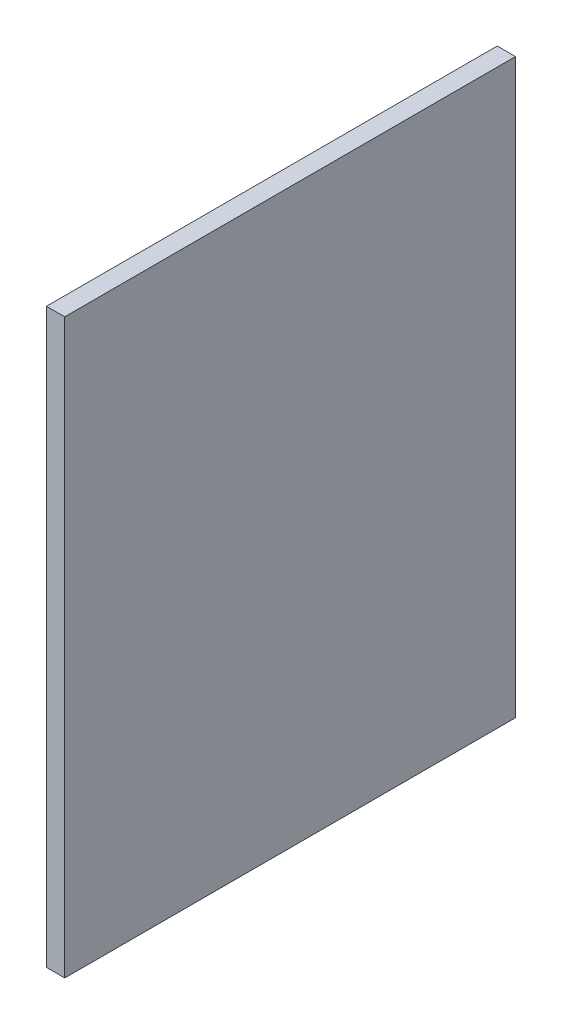
ISO-10303-21;
HEADER;
FILE_DESCRIPTION(('STEP AP214'),'2;1');
FILE_NAME('part.step','',(''),(''),'','','');
FILE_SCHEMA(('AUTOMOTIVE_DESIGN { 1 0 10303 214 1 1 1 1 }'));
ENDSEC;
DATA;
#1=APPLICATION_CONTEXT('core data for automotive mechanical design processes');
#2=APPLICATION_PROTOCOL_DEFINITION('international standard','automotive_design',2000,#1);
#3=PRODUCT_CONTEXT('',#1,'mechanical');
#4=PRODUCT('Part','Part','',(#3));
#5=PRODUCT_RELATED_PRODUCT_CATEGORY('part','',(#4));
#6=PRODUCT_DEFINITION_FORMATION('','',#4);
#7=PRODUCT_DEFINITION_CONTEXT('part definition',#1,'design');
#8=PRODUCT_DEFINITION('design','',#6,#7);
#9=PRODUCT_DEFINITION_SHAPE('','',#8);
#10=(LENGTH_UNIT() NAMED_UNIT(*) SI_UNIT(.MILLI.,.METRE.));
#11=(NAMED_UNIT(*) PLANE_ANGLE_UNIT() SI_UNIT($,.RADIAN.));
#12=(NAMED_UNIT(*) SI_UNIT($,.STERADIAN.) SOLID_ANGLE_UNIT());
#13=UNCERTAINTY_MEASURE_WITH_UNIT(LENGTH_MEASURE(1.E-05),#10,'distance_accuracy_value','');
#14=(GEOMETRIC_REPRESENTATION_CONTEXT(3) GLOBAL_UNCERTAINTY_ASSIGNED_CONTEXT((#13)) GLOBAL_UNIT_ASSIGNED_CONTEXT((#10,
#11,#12)) REPRESENTATION_CONTEXT('',''));
#15=CARTESIAN_POINT('',(0.,0.,0.));
#16=DIRECTION('',(0.,0.,1.));
#17=DIRECTION('',(1.,0.,0.));
#18=AXIS2_PLACEMENT_3D('',#15,#16,#17);
#19=CARTESIAN_POINT('',(1518.99999242226,970.,-460.));
#20=DIRECTION('',(0.,-1.,0.));
#21=DIRECTION('',(0.,0.,-1.));
#22=AXIS2_PLACEMENT_3D('',#19,#20,#21);
#23=PLANE('',#22);
#24=DIRECTION('',(0.,0.,1.));
#25=VECTOR('',#24,1.);
#26=CARTESIAN_POINT('',(1488.99999242226,970.,-460.));
#27=LINE('',#26,#25);
#28=CARTESIAN_POINT('',(1488.99999242226,970.,-460.));
#29=VERTEX_POINT('',#28);
#30=CARTESIAN_POINT('',(1488.99999242226,970.,280.));
#31=VERTEX_POINT('',#30);
#32=EDGE_CURVE('E61',#29,#31,#27,.T.);
#33=ORIENTED_EDGE('',*,*,#32,.T.);
#34=DIRECTION('',(-1.,0.,0.));
#35=VECTOR('',#34,1.);
#36=CARTESIAN_POINT('',(1518.99999242226,970.,280.));
#37=LINE('',#36,#35);
#38=CARTESIAN_POINT('',(1518.99999242226,970.,280.));
#39=VERTEX_POINT('',#38);
#40=EDGE_CURVE('E11',#39,#31,#37,.T.);
#41=ORIENTED_EDGE('',*,*,#40,.F.);
#42=DIRECTION('',(0.,0.,1.));
#43=VECTOR('',#42,1.);
#44=CARTESIAN_POINT('',(1518.99999242226,970.,-460.));
#45=LINE('',#44,#43);
#46=CARTESIAN_POINT('',(1518.99999242226,970.,-460.));
#47=VERTEX_POINT('',#46);
#48=EDGE_CURVE('E80',#47,#39,#45,.T.);
#49=ORIENTED_EDGE('',*,*,#48,.F.);
#50=DIRECTION('',(-1.,0.,0.));
#51=VECTOR('',#50,1.);
#52=CARTESIAN_POINT('',(1518.99999242226,970.,-460.));
#53=LINE('',#52,#51);
#54=EDGE_CURVE('E73',#47,#29,#53,.T.);
#55=ORIENTED_EDGE('',*,*,#54,.T.);
#56=EDGE_LOOP('',(#33,#41,#49,#55));
#57=FACE_BOUND('',#56,.T.);
#58=ADVANCED_FACE('F17',(#57),#23,.F.);
#59=CARTESIAN_POINT('',(1518.99999242226,970.,280.));
#60=DIRECTION('',(0.,0.,-1.));
#61=DIRECTION('',(0.,1.,0.));
#62=AXIS2_PLACEMENT_3D('',#59,#60,#61);
#63=PLANE('',#62);
#64=DIRECTION('',(0.,-1.,0.));
#65=VECTOR('',#64,1.);
#66=CARTESIAN_POINT('',(1488.99999242226,970.,280.));
#67=LINE('',#66,#65);
#68=CARTESIAN_POINT('',(1488.99999242226,30.0000000000009,280.));
#69=VERTEX_POINT('',#68);
#70=EDGE_CURVE('E57',#31,#69,#67,.T.);
#71=ORIENTED_EDGE('',*,*,#70,.T.);
#72=DIRECTION('',(-1.,0.,0.));
#73=VECTOR('',#72,1.);
#74=CARTESIAN_POINT('',(1518.99999242226,30.0000000000009,280.));
#75=LINE('',#74,#73);
#76=CARTESIAN_POINT('',(1518.99999242226,30.0000000000009,280.));
#77=VERTEX_POINT('',#76);
#78=EDGE_CURVE('E24',#77,#69,#75,.T.);
#79=ORIENTED_EDGE('',*,*,#78,.F.);
#80=DIRECTION('',(0.,-1.,0.));
#81=VECTOR('',#80,1.);
#82=CARTESIAN_POINT('',(1518.99999242226,970.,280.));
#83=LINE('',#82,#81);
#84=EDGE_CURVE('E69',#39,#77,#83,.T.);
#85=ORIENTED_EDGE('',*,*,#84,.F.);
#86=ORIENTED_EDGE('',*,*,#40,.T.);
#87=EDGE_LOOP('',(#71,#79,#85,#86));
#88=FACE_BOUND('',#87,.T.);
#89=ADVANCED_FACE('F68',(#88),#63,.F.);
#90=CARTESIAN_POINT('',(1518.99999242226,30.0000000000011,280.));
#91=DIRECTION('',(0.,1.,0.));
#92=DIRECTION('',(0.,0.,1.));
#93=AXIS2_PLACEMENT_3D('',#90,#91,#92);
#94=PLANE('',#93);
#95=DIRECTION('',(0.,0.,-1.));
#96=VECTOR('',#95,1.);
#97=CARTESIAN_POINT('',(1488.99999242226,30.0000000000011,280.));
#98=LINE('',#97,#96);
#99=CARTESIAN_POINT('',(1488.99999242226,30.0000000000011,-460.));
#100=VERTEX_POINT('',#99);
#101=EDGE_CURVE('E62',#69,#100,#98,.T.);
#102=ORIENTED_EDGE('',*,*,#101,.T.);
#103=DIRECTION('',(-1.,0.,0.));
#104=VECTOR('',#103,1.);
#105=CARTESIAN_POINT('',(1518.99999242226,30.0000000000011,-460.));
#106=LINE('',#105,#104);
#107=CARTESIAN_POINT('',(1518.99999242226,30.0000000000011,-460.));
#108=VERTEX_POINT('',#107);
#109=EDGE_CURVE('E85',#108,#100,#106,.T.);
#110=ORIENTED_EDGE('',*,*,#109,.F.);
#111=DIRECTION('',(0.,0.,-1.));
#112=VECTOR('',#111,1.);
#113=CARTESIAN_POINT('',(1518.99999242226,30.0000000000011,280.));
#114=LINE('',#113,#112);
#115=EDGE_CURVE('E36',#77,#108,#114,.T.);
#116=ORIENTED_EDGE('',*,*,#115,.F.);
#117=ORIENTED_EDGE('',*,*,#78,.T.);
#118=EDGE_LOOP('',(#102,#110,#116,#117));
#119=FACE_BOUND('',#118,.T.);
#120=ADVANCED_FACE('F88',(#119),#94,.F.);
#121=CARTESIAN_POINT('',(1518.99999242226,30.0000000000011,-460.));
#122=DIRECTION('',(0.,0.,1.));
#123=DIRECTION('',(0.,-1.,0.));
#124=AXIS2_PLACEMENT_3D('',#121,#122,#123);
#125=PLANE('',#124);
#126=DIRECTION('',(0.,1.,0.));
#127=VECTOR('',#126,1.);
#128=CARTESIAN_POINT('',(1488.99999242226,30.0000000000011,-460.));
#129=LINE('',#128,#127);
#130=EDGE_CURVE('E77',#100,#29,#129,.T.);
#131=ORIENTED_EDGE('',*,*,#130,.T.);
#132=ORIENTED_EDGE('',*,*,#54,.F.);
#133=DIRECTION('',(0.,1.,0.));
#134=VECTOR('',#133,1.);
#135=CARTESIAN_POINT('',(1518.99999242226,30.0000000000011,-460.));
#136=LINE('',#135,#134);
#137=EDGE_CURVE('E31',#108,#47,#136,.T.);
#138=ORIENTED_EDGE('',*,*,#137,.F.);
#139=ORIENTED_EDGE('',*,*,#109,.T.);
#140=EDGE_LOOP('',(#131,#132,#138,#139));
#141=FACE_BOUND('',#140,.T.);
#142=ADVANCED_FACE('F90',(#141),#125,.F.);
#143=CARTESIAN_POINT('',(1518.99999242226,970.,280.));
#144=DIRECTION('',(1.,0.,0.));
#145=DIRECTION('',(0.,0.,1.));
#146=AXIS2_PLACEMENT_3D('',#143,#144,#145);
#147=PLANE('',#146);
#148=ORIENTED_EDGE('',*,*,#48,.T.);
#149=ORIENTED_EDGE('',*,*,#84,.T.);
#150=ORIENTED_EDGE('',*,*,#115,.T.);
#151=ORIENTED_EDGE('',*,*,#137,.T.);
#152=EDGE_LOOP('',(#148,#149,#150,#151));
#153=FACE_BOUND('',#152,.T.);
#154=ADVANCED_FACE('F91',(#153),#147,.T.);
#155=CARTESIAN_POINT('',(1488.99999242226,970.,280.));
#156=DIRECTION('',(1.,0.,0.));
#157=DIRECTION('',(0.,0.,1.));
#158=AXIS2_PLACEMENT_3D('',#155,#156,#157);
#159=PLANE('',#158);
#160=ORIENTED_EDGE('',*,*,#32,.F.);
#161=ORIENTED_EDGE('',*,*,#130,.F.);
#162=ORIENTED_EDGE('',*,*,#101,.F.);
#163=ORIENTED_EDGE('',*,*,#70,.F.);
#164=EDGE_LOOP('',(#160,#161,#162,#163));
#165=FACE_BOUND('',#164,.T.);
#166=ADVANCED_FACE('F58',(#165),#159,.F.);
#167=CLOSED_SHELL('',(#58,#89,#120,#142,#154,#166));
#168=MANIFOLD_SOLID_BREP('B1',#167);
#169=ADVANCED_BREP_SHAPE_REPRESENTATION('',(#18,#168),#14);
#170=SHAPE_DEFINITION_REPRESENTATION(#9,#169);
ENDSEC;
END-ISO-10303-21;
